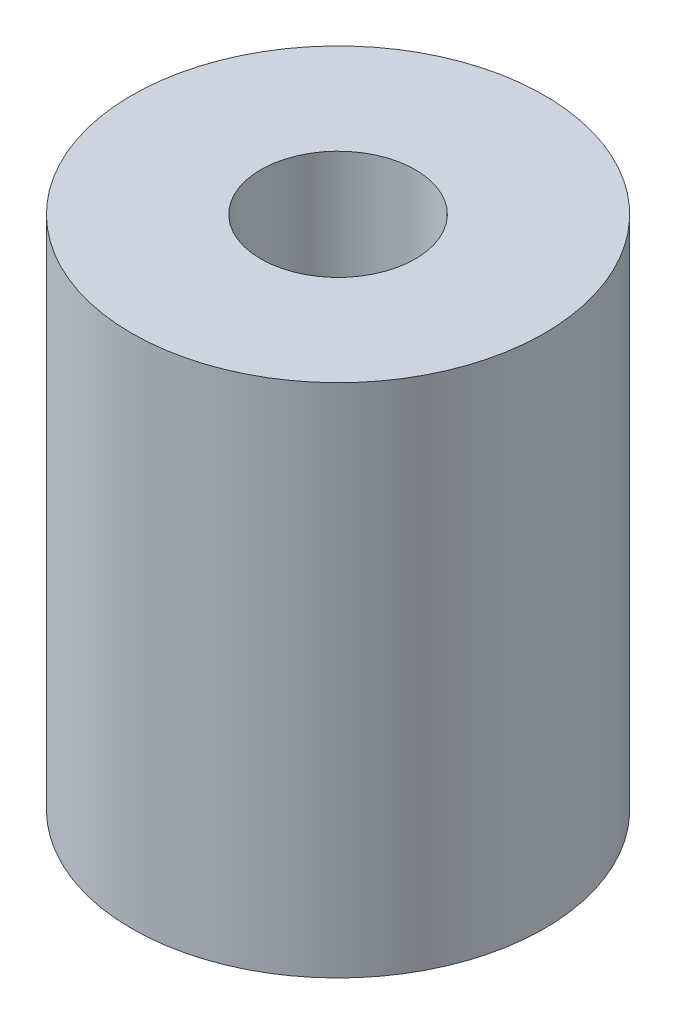
ISO-10303-21;
HEADER;
FILE_DESCRIPTION(('STEP AP214'),'2;1');
FILE_NAME('part.step','',(''),(''),'','','');
FILE_SCHEMA(('AUTOMOTIVE_DESIGN { 1 0 10303 214 1 1 1 1 }'));
ENDSEC;
DATA;
#1=APPLICATION_CONTEXT('core data for automotive mechanical design processes');
#2=APPLICATION_PROTOCOL_DEFINITION('international standard','automotive_design',2000,#1);
#3=PRODUCT_CONTEXT('',#1,'mechanical');
#4=PRODUCT('Part','Part','',(#3));
#5=PRODUCT_RELATED_PRODUCT_CATEGORY('part','',(#4));
#6=PRODUCT_DEFINITION_FORMATION('','',#4);
#7=PRODUCT_DEFINITION_CONTEXT('part definition',#1,'design');
#8=PRODUCT_DEFINITION('design','',#6,#7);
#9=PRODUCT_DEFINITION_SHAPE('','',#8);
#10=(LENGTH_UNIT() NAMED_UNIT(*) SI_UNIT(.MILLI.,.METRE.));
#11=(NAMED_UNIT(*) PLANE_ANGLE_UNIT() SI_UNIT($,.RADIAN.));
#12=(NAMED_UNIT(*) SI_UNIT($,.STERADIAN.) SOLID_ANGLE_UNIT());
#13=UNCERTAINTY_MEASURE_WITH_UNIT(LENGTH_MEASURE(1.E-05),#10,'distance_accuracy_value','');
#14=(GEOMETRIC_REPRESENTATION_CONTEXT(3) GLOBAL_UNCERTAINTY_ASSIGNED_CONTEXT((#13)) GLOBAL_UNIT_ASSIGNED_CONTEXT((#10,
#11,#12)) REPRESENTATION_CONTEXT('',''));
#15=CARTESIAN_POINT('',(0.,0.,0.));
#16=DIRECTION('',(0.,0.,1.));
#17=DIRECTION('',(1.,0.,0.));
#18=AXIS2_PLACEMENT_3D('',#15,#16,#17);
#19=CARTESIAN_POINT('',(0.,10.,0.));
#20=DIRECTION('',(0.,-1.,0.));
#21=DIRECTION('',(0.,0.,-1.));
#22=AXIS2_PLACEMENT_3D('',#19,#20,#21);
#23=CYLINDRICAL_SURFACE('',#22,4.);
#24=CARTESIAN_POINT('',(0.,10.,0.));
#25=DIRECTION('',(0.,1.,0.));
#26=DIRECTION('',(0.,0.,1.));
#27=AXIS2_PLACEMENT_3D('',#24,#25,#26);
#28=CIRCLE('',#27,4.);
#29=CARTESIAN_POINT('',(0.,10.,4.));
#30=VERTEX_POINT('',#29);
#31=EDGE_CURVE('E10',#30,#30,#28,.T.);
#32=ORIENTED_EDGE('',*,*,#31,.F.);
#33=EDGE_LOOP('',(#32));
#34=FACE_BOUND('',#33,.T.);
#35=CARTESIAN_POINT('',(0.,0.,0.));
#36=DIRECTION('',(0.,1.,0.));
#37=DIRECTION('',(0.,0.,1.));
#38=AXIS2_PLACEMENT_3D('',#35,#36,#37);
#39=CIRCLE('',#38,4.);
#40=CARTESIAN_POINT('',(0.,0.,4.));
#41=VERTEX_POINT('',#40);
#42=EDGE_CURVE('E40',#41,#41,#39,.T.);
#43=ORIENTED_EDGE('',*,*,#42,.T.);
#44=EDGE_LOOP('',(#43));
#45=FACE_BOUND('',#44,.T.);
#46=ADVANCED_FACE('F37',(#34,#45),#23,.T.);
#47=CARTESIAN_POINT('',(0.,10.,0.));
#48=DIRECTION('',(0.,1.,0.));
#49=DIRECTION('',(0.,0.,1.));
#50=AXIS2_PLACEMENT_3D('',#47,#48,#49);
#51=PLANE('',#50);
#52=CARTESIAN_POINT('',(0.,10.,0.));
#53=DIRECTION('',(0.,1.,0.));
#54=DIRECTION('',(0.,0.,1.));
#55=AXIS2_PLACEMENT_3D('',#52,#53,#54);
#56=CIRCLE('',#55,1.5);
#57=CARTESIAN_POINT('',(0.,10.,1.5));
#58=VERTEX_POINT('',#57);
#59=EDGE_CURVE('E51',#58,#58,#56,.T.);
#60=ORIENTED_EDGE('',*,*,#59,.F.);
#61=EDGE_LOOP('',(#60));
#62=FACE_BOUND('',#61,.T.);
#63=ORIENTED_EDGE('',*,*,#31,.T.);
#64=EDGE_LOOP('',(#63));
#65=FACE_BOUND('',#64,.T.);
#66=ADVANCED_FACE('F68',(#62,#65),#51,.T.);
#67=CARTESIAN_POINT('',(0.,0.,0.));
#68=DIRECTION('',(0.,1.,0.));
#69=DIRECTION('',(0.,0.,1.));
#70=AXIS2_PLACEMENT_3D('',#67,#68,#69);
#71=PLANE('',#70);
#72=CARTESIAN_POINT('',(0.,0.,0.));
#73=DIRECTION('',(0.,1.,0.));
#74=DIRECTION('',(0.,0.,1.));
#75=AXIS2_PLACEMENT_3D('',#72,#73,#74);
#76=CIRCLE('',#75,1.5);
#77=CARTESIAN_POINT('',(0.,0.,1.5));
#78=VERTEX_POINT('',#77);
#79=EDGE_CURVE('E49',#78,#78,#76,.T.);
#80=ORIENTED_EDGE('',*,*,#79,.T.);
#81=EDGE_LOOP('',(#80));
#82=FACE_BOUND('',#81,.T.);
#83=ORIENTED_EDGE('',*,*,#42,.F.);
#84=EDGE_LOOP('',(#83));
#85=FACE_BOUND('',#84,.T.);
#86=ADVANCED_FACE('F59',(#82,#85),#71,.F.);
#87=CARTESIAN_POINT('',(0.,0.,0.));
#88=DIRECTION('',(0.,1.,0.));
#89=DIRECTION('',(0.,0.,1.));
#90=AXIS2_PLACEMENT_3D('',#87,#88,#89);
#91=CYLINDRICAL_SURFACE('',#90,1.5);
#92=ORIENTED_EDGE('',*,*,#79,.F.);
#93=EDGE_LOOP('',(#92));
#94=FACE_BOUND('',#93,.T.);
#95=ORIENTED_EDGE('',*,*,#59,.T.);
#96=EDGE_LOOP('',(#95));
#97=FACE_BOUND('',#96,.T.);
#98=ADVANCED_FACE('F62',(#94,#97),#91,.F.);
#99=CLOSED_SHELL('',(#46,#66,#86,#98));
#100=MANIFOLD_SOLID_BREP('B2',#99);
#101=ADVANCED_BREP_SHAPE_REPRESENTATION('',(#18,#100),#14);
#102=SHAPE_DEFINITION_REPRESENTATION(#9,#101);
ENDSEC;
END-ISO-10303-21;
